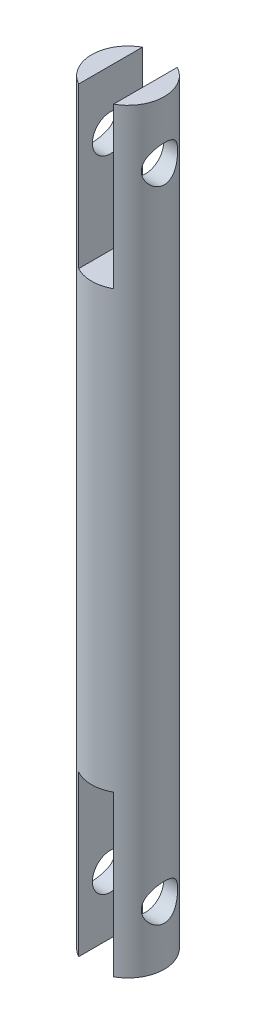
ISO-10303-21;
HEADER;
FILE_DESCRIPTION(('STEP AP214'),'2;1');
FILE_NAME('part.step','',(''),(''),'','','');
FILE_SCHEMA(('AUTOMOTIVE_DESIGN { 1 0 10303 214 1 1 1 1 }'));
ENDSEC;
DATA;
#1=APPLICATION_CONTEXT('core data for automotive mechanical design processes');
#2=APPLICATION_PROTOCOL_DEFINITION('international standard','automotive_design',2000,#1);
#3=PRODUCT_CONTEXT('',#1,'mechanical');
#4=PRODUCT('Part','Part','',(#3));
#5=PRODUCT_RELATED_PRODUCT_CATEGORY('part','',(#4));
#6=PRODUCT_DEFINITION_FORMATION('','',#4);
#7=PRODUCT_DEFINITION_CONTEXT('part definition',#1,'design');
#8=PRODUCT_DEFINITION('design','',#6,#7);
#9=PRODUCT_DEFINITION_SHAPE('','',#8);
#10=(LENGTH_UNIT() NAMED_UNIT(*) SI_UNIT(.MILLI.,.METRE.));
#11=(NAMED_UNIT(*) PLANE_ANGLE_UNIT() SI_UNIT($,.RADIAN.));
#12=(NAMED_UNIT(*) SI_UNIT($,.STERADIAN.) SOLID_ANGLE_UNIT());
#13=UNCERTAINTY_MEASURE_WITH_UNIT(LENGTH_MEASURE(1.E-05),#10,'distance_accuracy_value','');
#14=(GEOMETRIC_REPRESENTATION_CONTEXT(3) GLOBAL_UNCERTAINTY_ASSIGNED_CONTEXT((#13)) GLOBAL_UNIT_ASSIGNED_CONTEXT((#10,
#11,#12)) REPRESENTATION_CONTEXT('',''));
#15=CARTESIAN_POINT('',(0.,0.,0.));
#16=DIRECTION('',(0.,0.,1.));
#17=DIRECTION('',(1.,0.,0.));
#18=AXIS2_PLACEMENT_3D('',#15,#16,#17);
#19=CARTESIAN_POINT('',(0.,52.,0.));
#20=DIRECTION('',(0.,1.,0.));
#21=DIRECTION('',(0.,0.,-1.));
#22=AXIS2_PLACEMENT_3D('',#19,#20,#21);
#23=PLANE('',#22);
#24=DIRECTION('',(0.,0.,-1.));
#25=VECTOR('',#24,1.);
#26=CARTESIAN_POINT('',(-1.2,52.,2.5));
#27=LINE('',#26,#25);
#28=CARTESIAN_POINT('',(-1.2,52.,2.19317121994613));
#29=VERTEX_POINT('',#28);
#30=CARTESIAN_POINT('',(-1.2,52.,-2.19317121994613));
#31=VERTEX_POINT('',#30);
#32=EDGE_CURVE('E114',#29,#31,#27,.T.);
#33=ORIENTED_EDGE('',*,*,#32,.T.);
#34=CARTESIAN_POINT('',(0.,52.,0.));
#35=DIRECTION('',(0.,-1.,0.));
#36=DIRECTION('',(0.,0.,-1.));
#37=AXIS2_PLACEMENT_3D('',#34,#35,#36);
#38=CIRCLE('',#37,2.5);
#39=EDGE_CURVE('E128',#29,#31,#38,.T.);
#40=ORIENTED_EDGE('',*,*,#39,.F.);
#41=EDGE_LOOP('',(#33,#40));
#42=FACE_BOUND('',#41,.T.);
#43=ADVANCED_FACE('F43',(#42),#23,.T.);
#44=CARTESIAN_POINT('',(-2.5,48.,0.));
#45=DIRECTION('',(1.,0.,0.));
#46=DIRECTION('',(0.,0.,1.));
#47=AXIS2_PLACEMENT_3D('',#44,#45,#46);
#48=CYLINDRICAL_SURFACE('',#47,1.25);
#49=CARTESIAN_POINT('',(-1.2,48.,0.));
#50=DIRECTION('',(1.,0.,0.));
#51=DIRECTION('',(0.,0.,-1.));
#52=AXIS2_PLACEMENT_3D('',#49,#50,#51);
#53=CIRCLE('',#52,1.25);
#54=CARTESIAN_POINT('',(-1.2,48.,-1.25));
#55=VERTEX_POINT('',#54);
#56=EDGE_CURVE('E213',#55,#55,#53,.F.);
#57=ORIENTED_EDGE('',*,*,#56,.F.);
#58=EDGE_LOOP('',(#57));
#59=FACE_BOUND('',#58,.T.);
#60=CARTESIAN_POINT('',(-2.5,46.75,0.));
#61=CARTESIAN_POINT('',(-2.49999641755189,46.7500041278994,0.0657149536912329));
#62=CARTESIAN_POINT('',(-2.49738113774397,46.7552125914021,0.131508249622541));
#63=CARTESIAN_POINT('',(-2.48717695046745,46.7758161004261,0.261150294085531));
#64=CARTESIAN_POINT('',(-2.47957859786229,46.7912304912471,0.324995108391879));
#65=CARTESIAN_POINT('',(-2.46020349254139,46.831492260771,0.448666931100718));
#66=CARTESIAN_POINT('',(-2.448442989719,46.85630298031,0.508508503673975));
#67=CARTESIAN_POINT('',(-2.42182220644723,46.9144632767062,0.623090771008206));
#68=CARTESIAN_POINT('',(-2.40696217041913,46.9478121803111,0.677831867487562));
#69=CARTESIAN_POINT('',(-2.37445322822571,47.0243965618566,0.784384772202396));
#70=CARTESIAN_POINT('',(-2.3566899890942,47.0681080990496,0.835819013902634));
#71=CARTESIAN_POINT('',(-2.32074962808431,47.1631518490588,0.930974306083716));
#72=CARTESIAN_POINT('',(-2.30257220261294,47.2144898147155,0.974689478883455));
#73=CARTESIAN_POINT('',(-2.26623688996684,47.3281041869042,1.05656500056285));
#74=CARTESIAN_POINT('',(-2.24818983712665,47.3909201229324,1.09403166943955));
#75=CARTESIAN_POINT('',(-2.21607473465401,47.5229591699828,1.15771028361337));
#76=CARTESIAN_POINT('',(-2.20200384508737,47.5921776609034,1.18393026870792));
#77=CARTESIAN_POINT('',(-2.18072333797261,47.7308313817774,1.22266555273573));
#78=CARTESIAN_POINT('',(-2.17315339479642,47.8000055650842,1.23590732135055));
#79=CARTESIAN_POINT('',(-2.1647736243566,47.9399735472244,1.25053374163606));
#80=CARTESIAN_POINT('',(-2.1639571167911,48.0107656760889,1.25193011046634));
#81=CARTESIAN_POINT('',(-2.16888662821561,48.1428575303942,1.24335910896537));
#82=CARTESIAN_POINT('',(-2.17385954577517,48.2042800390288,1.23473069942102));
#83=CARTESIAN_POINT('',(-2.18845285917313,48.3246523867163,1.20867481132116));
#84=CARTESIAN_POINT('',(-2.1980747353972,48.3836014316316,1.19124452987206));
#85=CARTESIAN_POINT('',(-2.22109345515926,48.4990364157071,1.1477622254825));
#86=CARTESIAN_POINT('',(-2.23457300829998,48.5554329984822,1.12151883389499));
#87=CARTESIAN_POINT('',(-2.26379255351755,48.6632928657375,1.061302109585));
#88=CARTESIAN_POINT('',(-2.27953355975238,48.7147539195001,1.02732530476558));
#89=CARTESIAN_POINT('',(-2.31391447379107,48.818151565929,0.947582568640984));
#90=CARTESIAN_POINT('',(-2.33266887795933,48.8693210919702,0.9008680729616));
#91=CARTESIAN_POINT('',(-2.36934529125509,48.9634192732386,0.799444473426714));
#92=CARTESIAN_POINT('',(-2.38726689948501,49.0063439900424,0.744731570717854));
#93=CARTESIAN_POINT('',(-2.42127484103705,49.0846070762872,0.625645632289809));
#94=CARTESIAN_POINT('',(-2.43723730202509,49.1195005905572,0.56094198949926));
#95=CARTESIAN_POINT('',(-2.46447351401553,49.1776212863038,0.425582769360996));
#96=CARTESIAN_POINT('',(-2.47575098679441,49.200857731269,0.354931970331595));
#97=CARTESIAN_POINT('',(-2.49155417176795,49.2330942546458,0.215958114575876));
#98=CARTESIAN_POINT('',(-2.4965617287664,49.2431140446835,0.147926913185405));
#99=CARTESIAN_POINT('',(-2.50091266823877,49.2518309139181,0.0109744999366913));
#100=CARTESIAN_POINT('',(-2.5002587340164,49.2505333570493,-0.0579462748373776));
#101=CARTESIAN_POINT('',(-2.49363990316801,49.2372416394766,-0.189041214982493));
#102=CARTESIAN_POINT('',(-2.48809057110237,49.2260843340875,-0.251324260062444));
#103=CARTESIAN_POINT('',(-2.47277714143524,49.1947024101311,-0.373008615377397));
#104=CARTESIAN_POINT('',(-2.46301257917916,49.1744767919333,-0.432409607113746));
#105=CARTESIAN_POINT('',(-2.43980314267087,49.1250019169585,-0.548610760562083));
#106=CARTESIAN_POINT('',(-2.42626102212424,49.095511187354,-0.605287996257694));
#107=CARTESIAN_POINT('',(-2.39679967896386,49.0286155804424,-0.713076702123653));
#108=CARTESIAN_POINT('',(-2.38087944457231,48.9912073317582,-0.764185787219102));
#109=CARTESIAN_POINT('',(-2.34635276671831,48.9052994683339,-0.864709611613315));
#110=CARTESIAN_POINT('',(-2.32763606060552,48.856071414433,-0.913465097280797));
#111=CARTESIAN_POINT('',(-2.29077989504843,48.7500935609134,-1.00232040139155));
#112=CARTESIAN_POINT('',(-2.27264084226908,48.6933386014795,-1.04241423211355));
#113=CARTESIAN_POINT('',(-2.23813990282585,48.5704454322496,-1.11463489312212));
#114=CARTESIAN_POINT('',(-2.2219066207934,48.5039859172393,-1.14628186984829));
#115=CARTESIAN_POINT('',(-2.19467590460158,48.3656124153843,-1.19760353251725));
#116=CARTESIAN_POINT('',(-2.18367172800773,48.2937055918735,-1.21729364485946));
#117=CARTESIAN_POINT('',(-2.16951876260834,48.1538622214232,-1.2423271093121));
#118=CARTESIAN_POINT('',(-2.16571729325614,48.0862071832137,-1.24886624550108));
#119=CARTESIAN_POINT('',(-2.16456693307719,47.9506911660366,-1.25086144297598));
#120=CARTESIAN_POINT('',(-2.16721524534441,47.8828302890757,-1.2463223082805));
#121=CARTESIAN_POINT('',(-2.17797327562531,47.755645623085,-1.22740765699033));
#122=CARTESIAN_POINT('',(-2.18553868102992,47.6961244123195,-1.2140103929285));
#123=CARTESIAN_POINT('',(-2.20463770234897,47.5802398507191,-1.1789691977808));
#124=CARTESIAN_POINT('',(-2.21617259462095,47.523877522385,-1.15732261394976));
#125=CARTESIAN_POINT('',(-2.2428566295566,47.4117189362667,-1.10476968162585));
#126=CARTESIAN_POINT('',(-2.25819652995238,47.3562151227129,-1.07333892227057));
#127=CARTESIAN_POINT('',(-2.29044164543238,47.2509068297743,-1.00268871454579));
#128=CARTESIAN_POINT('',(-2.30734767243153,47.2011053368519,-0.963465214048306));
#129=CARTESIAN_POINT('',(-2.34327903949141,47.102322522053,-0.872754158330797));
#130=CARTESIAN_POINT('',(-2.36231229139336,47.0541761220476,-0.820355528762708));
#131=CARTESIAN_POINT('',(-2.3984719031886,46.9671712707205,-0.707693507775343));
#132=CARTESIAN_POINT('',(-2.4155972326005,46.9283178257171,-0.647425904070976));
#133=CARTESIAN_POINT('',(-2.44622511981379,46.8609545465472,-0.519914496024928));
#134=CARTESIAN_POINT('',(-2.45970120703636,46.8325197882357,-0.452624379918262));
#135=CARTESIAN_POINT('',(-2.48126676704332,46.7877397901013,-0.313427626617734));
#136=CARTESIAN_POINT('',(-2.48937154216165,46.771360191463,-0.241534749528954));
#137=CARTESIAN_POINT('',(-2.49619327387079,46.7576282361552,-0.140752433104227));
#138=CARTESIAN_POINT('',(-2.49761706674002,46.7547716989205,-0.112702349299371));
#139=CARTESIAN_POINT('',(-2.49952121222331,46.750956668104,-0.0564396647589457));
#140=CARTESIAN_POINT('',(-2.50000153879704,46.749998226911,-0.0282270595592261));
#141=CARTESIAN_POINT('',(-2.5,46.75,0.));
#142=B_SPLINE_CURVE_WITH_KNOTS('',3,(#60,#61,#62,#63,#64,#65,#66,#67,#68,#69,#70,#71,#72,#73,
#74,#75,#76,#77,#78,#79,#80,#81,#82,#83,#84,#85,#86,#87,#88,#89,#90,#91,#92,#93,#94,#95,#96,#97,
#98,#99,#100,#101,#102,#103,#104,#105,#106,#107,#108,#109,#110,#111,#112,#113,#114,#115,#116,
#117,#118,#119,#120,#121,#122,#123,#124,#125,#126,#127,#128,#129,#130,#131,#132,#133,#134,#135,
#136,#137,#138,#139,#140,#141),.UNSPECIFIED.,.T.,.F.,(4,2,2,2,2,2,2,2,2,2,2,2,2,2,2,2,2,2,2,2,2,
2,2,2,2,2,2,2,2,2,2,2,2,2,2,2,2,2,2,2,4),(0.,0.197030321775365,0.394435187136497,
0.591077694365375,0.787704700726956,0.9962271983976,1.20490779706754,1.42977158038441,
1.65447434872851,1.86572515175287,2.07676696661275,2.2625714051165,2.44843504907097,
2.63862800210609,2.82890651575277,3.04331176667347,3.25781918248357,3.4822877776805,
3.70657771140349,3.91229113089181,4.11790705639344,4.30758633132651,4.49728652038664,
4.69241070034873,4.88761813435423,5.10199513305522,5.31651985769288,5.54143352699591,
5.76605639925971,5.96911634372966,6.17208824825005,6.35572412805227,6.53941910979597,
6.73545570969517,6.93159451423696,7.15156553440622,7.37165479220715,7.59330017078655,
7.81431135781161,7.8989410017212,7.98357298143557),.UNSPECIFIED.);
#143=CARTESIAN_POINT('',(-2.5,46.75,0.));
#144=VERTEX_POINT('',#143);
#145=EDGE_CURVE('E158',#144,#144,#142,.T.);
#146=ORIENTED_EDGE('',*,*,#145,.T.);
#147=EDGE_LOOP('',(#146));
#148=FACE_BOUND('',#147,.T.);
#149=ADVANCED_FACE('F171',(#59,#148),#48,.F.);
#150=CARTESIAN_POINT('',(0.,52.,0.));
#151=DIRECTION('',(0.,-1.,0.));
#152=DIRECTION('',(0.,0.,1.));
#153=AXIS2_PLACEMENT_3D('',#150,#151,#152);
#154=CYLINDRICAL_SURFACE('',#153,2.5);
#155=CARTESIAN_POINT('',(0.,41.,0.));
#156=DIRECTION('',(0.,1.,0.));
#157=DIRECTION('',(0.,0.,1.));
#158=AXIS2_PLACEMENT_3D('',#155,#156,#157);
#159=CIRCLE('',#158,2.5);
#160=CARTESIAN_POINT('',(1.2,41.,-2.19317121994613));
#161=VERTEX_POINT('',#160);
#162=CARTESIAN_POINT('',(-1.2,41.,-2.19317121994613));
#163=VERTEX_POINT('',#162);
#164=EDGE_CURVE('E11',#161,#163,#159,.T.);
#165=ORIENTED_EDGE('',*,*,#164,.F.);
#166=DIRECTION('',(0.,-1.,0.));
#167=VECTOR('',#166,1.);
#168=CARTESIAN_POINT('',(1.2,52.,-2.19317121994613));
#169=LINE('',#168,#167);
#170=CARTESIAN_POINT('',(1.2,52.,-2.19317121994613));
#171=VERTEX_POINT('',#170);
#172=EDGE_CURVE('E123',#171,#161,#169,.T.);
#173=ORIENTED_EDGE('',*,*,#172,.F.);
#174=CARTESIAN_POINT('',(1.2,52.,2.19317121994613));
#175=VERTEX_POINT('',#174);
#176=EDGE_CURVE('E111',#171,#175,#38,.T.);
#177=ORIENTED_EDGE('',*,*,#176,.T.);
#178=DIRECTION('',(0.,-1.,0.));
#179=VECTOR('',#178,1.);
#180=CARTESIAN_POINT('',(1.2,52.,2.19317121994613));
#181=LINE('',#180,#179);
#182=CARTESIAN_POINT('',(1.2,41.,2.19317121994613));
#183=VERTEX_POINT('',#182);
#184=EDGE_CURVE('E117',#183,#175,#181,.F.);
#185=ORIENTED_EDGE('',*,*,#184,.F.);
#186=CARTESIAN_POINT('',(-1.2,41.,2.19317121994613));
#187=VERTEX_POINT('',#186);
#188=EDGE_CURVE('E48',#187,#183,#159,.T.);
#189=ORIENTED_EDGE('',*,*,#188,.F.);
#190=DIRECTION('',(0.,-1.,0.));
#191=VECTOR('',#190,1.);
#192=CARTESIAN_POINT('',(-1.2,52.,2.19317121994613));
#193=LINE('',#192,#191);
#194=EDGE_CURVE('E150',#29,#187,#193,.T.);
#195=ORIENTED_EDGE('',*,*,#194,.F.);
#196=ORIENTED_EDGE('',*,*,#39,.T.);
#197=DIRECTION('',(0.,-1.,0.));
#198=VECTOR('',#197,1.);
#199=CARTESIAN_POINT('',(-1.2,52.,-2.19317121994613));
#200=LINE('',#199,#198);
#201=EDGE_CURVE('E214',#163,#31,#200,.F.);
#202=ORIENTED_EDGE('',*,*,#201,.F.);
#203=EDGE_LOOP('',(#165,#173,#177,#185,#189,#195,#196,#202));
#204=FACE_BOUND('',#203,.T.);
#205=CARTESIAN_POINT('',(-2.5,2.75,0.));
#206=CARTESIAN_POINT('',(-2.49999641755189,2.75000412789938,0.0657149536912331));
#207=CARTESIAN_POINT('',(-2.49738113774397,2.75521259140209,0.131508249622541));
#208=CARTESIAN_POINT('',(-2.48717695046745,2.77581610042615,0.261150294085532));
#209=CARTESIAN_POINT('',(-2.47957859786229,2.79123049124706,0.32499510839188));
#210=CARTESIAN_POINT('',(-2.46020349254139,2.83149226077099,0.448666931100718));
#211=CARTESIAN_POINT('',(-2.448442989719,2.85630298031002,0.508508503673975));
#212=CARTESIAN_POINT('',(-2.42182220644723,2.91446327670618,0.623090771008207));
#213=CARTESIAN_POINT('',(-2.40696217041912,2.94781218031107,0.677831867487563));
#214=CARTESIAN_POINT('',(-2.37445322822571,3.02439656185662,0.784384772202399));
#215=CARTESIAN_POINT('',(-2.3566899890942,3.06810809904955,0.835819013902641));
#216=CARTESIAN_POINT('',(-2.3207496280843,3.16315184905879,0.930974306083722));
#217=CARTESIAN_POINT('',(-2.30257220261294,3.21448981471555,0.974689478883458));
#218=CARTESIAN_POINT('',(-2.26623688996684,3.32810418690423,1.05656500056285));
#219=CARTESIAN_POINT('',(-2.24818983712665,3.39092012293239,1.09403166943955));
#220=CARTESIAN_POINT('',(-2.21607473465401,3.52295916998277,1.15771028361337));
#221=CARTESIAN_POINT('',(-2.20200384508737,3.59217766090344,1.18393026870792));
#222=CARTESIAN_POINT('',(-2.18072333797261,3.7308313817774,1.22266555273573));
#223=CARTESIAN_POINT('',(-2.17315339479642,3.80000556508424,1.23590732135055));
#224=CARTESIAN_POINT('',(-2.1647736243566,3.93997354722434,1.25053374163606));
#225=CARTESIAN_POINT('',(-2.1639571167911,4.01076567608894,1.25193011046634));
#226=CARTESIAN_POINT('',(-2.16888662821561,4.14285753039421,1.24335910896537));
#227=CARTESIAN_POINT('',(-2.17385954577517,4.20428003902881,1.23473069942103));
#228=CARTESIAN_POINT('',(-2.18845285917313,4.3246523867163,1.20867481132117));
#229=CARTESIAN_POINT('',(-2.1980747353972,4.38360143163164,1.19124452987206));
#230=CARTESIAN_POINT('',(-2.22109345515926,4.49903641570707,1.1477622254825));
#231=CARTESIAN_POINT('',(-2.23457300829998,4.55543299848223,1.12151883389499));
#232=CARTESIAN_POINT('',(-2.26379255351755,4.66329286573751,1.061302109585));
#233=CARTESIAN_POINT('',(-2.27953355975238,4.71475391950011,1.02732530476558));
#234=CARTESIAN_POINT('',(-2.31391447379107,4.81815156592903,0.947582568640986));
#235=CARTESIAN_POINT('',(-2.33266887795933,4.8693210919702,0.900868072961602));
#236=CARTESIAN_POINT('',(-2.36934529125509,4.96341927323863,0.799444473426716));
#237=CARTESIAN_POINT('',(-2.38726689948501,5.00634399004235,0.744731570717856));
#238=CARTESIAN_POINT('',(-2.42127484103705,5.08460707628716,0.625645632289809));
#239=CARTESIAN_POINT('',(-2.43723730202509,5.11950059055718,0.56094198949926));
#240=CARTESIAN_POINT('',(-2.46447351401553,5.17762128630376,0.425582769360995));
#241=CARTESIAN_POINT('',(-2.47575098679441,5.20085773126896,0.354931970331594));
#242=CARTESIAN_POINT('',(-2.49155417176795,5.23309425464584,0.215958114575876));
#243=CARTESIAN_POINT('',(-2.4965617287664,5.24311404468347,0.147926913185404));
#244=CARTESIAN_POINT('',(-2.50091266823877,5.25183091391811,0.0109744999366911));
#245=CARTESIAN_POINT('',(-2.5002587340164,5.25053335704935,-0.0579462748373775));
#246=CARTESIAN_POINT('',(-2.49363990316801,5.23724163947656,-0.189041214982492));
#247=CARTESIAN_POINT('',(-2.48809057110237,5.22608433408746,-0.251324260062443));
#248=CARTESIAN_POINT('',(-2.47277714143524,5.19470241013114,-0.373008615377396));
#249=CARTESIAN_POINT('',(-2.46301257917916,5.1744767919333,-0.432409607113746));
#250=CARTESIAN_POINT('',(-2.43980314267087,5.12500191695853,-0.548610760562081));
#251=CARTESIAN_POINT('',(-2.42626102212424,5.09551118735398,-0.605287996257691));
#252=CARTESIAN_POINT('',(-2.39679967896386,5.02861558044245,-0.71307670212365));
#253=CARTESIAN_POINT('',(-2.38087944457231,4.99120733175821,-0.764185787219102));
#254=CARTESIAN_POINT('',(-2.34635276671831,4.90529946833391,-0.864709611613316));
#255=CARTESIAN_POINT('',(-2.32763606060552,4.85607141443304,-0.913465097280798));
#256=CARTESIAN_POINT('',(-2.29077989504843,4.75009356091337,-1.00232040139155));
#257=CARTESIAN_POINT('',(-2.27264084226908,4.69333860147953,-1.04241423211355));
#258=CARTESIAN_POINT('',(-2.23813990282585,4.57044543224961,-1.11463489312212));
#259=CARTESIAN_POINT('',(-2.2219066207934,4.50398591723926,-1.1462818698483));
#260=CARTESIAN_POINT('',(-2.19467590460158,4.36561241538435,-1.19760353251725));
#261=CARTESIAN_POINT('',(-2.18367172800773,4.29370559187352,-1.21729364485946));
#262=CARTESIAN_POINT('',(-2.16951876260833,4.15386222142319,-1.2423271093121));
#263=CARTESIAN_POINT('',(-2.16571729325614,4.0862071832137,-1.24886624550108));
#264=CARTESIAN_POINT('',(-2.16456693307719,3.95069116603659,-1.25086144297598));
#265=CARTESIAN_POINT('',(-2.16721524534441,3.88283028907571,-1.2463223082805));
#266=CARTESIAN_POINT('',(-2.17797327562531,3.75564562308498,-1.22740765699033));
#267=CARTESIAN_POINT('',(-2.18553868102992,3.6961244123195,-1.2140103929285));
#268=CARTESIAN_POINT('',(-2.20463770234897,3.58023985071912,-1.17896919778081));
#269=CARTESIAN_POINT('',(-2.21617259462095,3.52387752238504,-1.15732261394976));
#270=CARTESIAN_POINT('',(-2.2428566295566,3.41171893626674,-1.10476968162585));
#271=CARTESIAN_POINT('',(-2.25819652995238,3.35621512271287,-1.07333892227057));
#272=CARTESIAN_POINT('',(-2.29044164543238,3.25090682977427,-1.00268871454579));
#273=CARTESIAN_POINT('',(-2.30734767243153,3.20110533685189,-0.963465214048309));
#274=CARTESIAN_POINT('',(-2.34327903949141,3.10232252205298,-0.8727541583308));
#275=CARTESIAN_POINT('',(-2.36231229139336,3.0541761220476,-0.820355528762712));
#276=CARTESIAN_POINT('',(-2.3984719031886,2.96717127072046,-0.707693507775348));
#277=CARTESIAN_POINT('',(-2.4155972326005,2.92831782571714,-0.64742590407098));
#278=CARTESIAN_POINT('',(-2.44622511981379,2.86095454654725,-0.519914496024933));
#279=CARTESIAN_POINT('',(-2.45970120703636,2.83251978823571,-0.452624379918268));
#280=CARTESIAN_POINT('',(-2.48126676704332,2.78773979010131,-0.313427626617739));
#281=CARTESIAN_POINT('',(-2.48937154216165,2.77136019146303,-0.241534749528957));
#282=CARTESIAN_POINT('',(-2.49619327387079,2.75762823615519,-0.140752433104229));
#283=CARTESIAN_POINT('',(-2.49761706674002,2.75477169892048,-0.112702349299373));
#284=CARTESIAN_POINT('',(-2.49952121222331,2.75095666810399,-0.0564396647589469));
#285=CARTESIAN_POINT('',(-2.50000153879704,2.749998226911,-0.0282270595592267));
#286=CARTESIAN_POINT('',(-2.5,2.75,0.));
#287=B_SPLINE_CURVE_WITH_KNOTS('',3,(#205,#206,#207,#208,#209,#210,#211,#212,#213,#214,#215,
#216,#217,#218,#219,#220,#221,#222,#223,#224,#225,#226,#227,#228,#229,#230,#231,#232,#233,#234,
#235,#236,#237,#238,#239,#240,#241,#242,#243,#244,#245,#246,#247,#248,#249,#250,#251,#252,#253,
#254,#255,#256,#257,#258,#259,#260,#261,#262,#263,#264,#265,#266,#267,#268,#269,#270,#271,#272,
#273,#274,#275,#276,#277,#278,#279,#280,#281,#282,#283,#284,#285,#286),.UNSPECIFIED.,.T.,.F.,(4,
2,2,2,2,2,2,2,2,2,2,2,2,2,2,2,2,2,2,2,2,2,2,2,2,2,2,2,2,2,2,2,2,2,2,2,2,2,2,2,4),(0.,
0.197030321775366,0.394435187136497,0.591077694365373,0.78770470072696,0.996227198397612,
1.20490779706755,1.42977158038441,1.65447434872851,1.86572515175287,2.07676696661275,
2.2625714051165,2.44843504907098,2.63862800210609,2.82890651575277,3.04331176667348,
3.25781918248358,3.48228777768051,3.70657771140349,3.91229113089182,4.11790705639345,
4.30758633132652,4.49728652038664,4.69241070034873,4.88761813435424,5.10199513305523,
5.31651985769289,5.54143352699592,5.76605639925972,5.96911634372967,6.17208824825007,
6.35572412805228,6.53941910979597,6.73545570969517,6.93159451423697,7.15156553440623,
7.37165479220716,7.59330017078656,7.81431135781162,7.89894100172122,7.98357298143558),.UNSPECIFIED.);
#288=CARTESIAN_POINT('',(-2.5,2.75,0.));
#289=VERTEX_POINT('',#288);
#290=EDGE_CURVE('E225',#289,#289,#287,.T.);
#291=ORIENTED_EDGE('',*,*,#290,.F.);
#292=EDGE_LOOP('',(#291));
#293=FACE_BOUND('',#292,.T.);
#294=CARTESIAN_POINT('',(2.1650635094611,4.,1.25));
#295=CARTESIAN_POINT('',(2.16506918410574,3.93486523975594,1.24999545384316));
#296=CARTESIAN_POINT('',(2.16804751484696,3.86964823559369,1.24487496341652));
#297=CARTESIAN_POINT('',(2.17952958065066,3.74121591915356,1.22465401237257));
#298=CARTESIAN_POINT('',(2.18804492569449,3.67800510619574,1.20953258069272));
#299=CARTESIAN_POINT('',(2.20936683256748,3.55568541957007,1.17012493587476));
#300=CARTESIAN_POINT('',(2.22215054341565,3.49655668440802,1.14588744061716));
#301=CARTESIAN_POINT('',(2.25053331021072,3.3832197475041,1.08908440672047));
#302=CARTESIAN_POINT('',(2.26613251845081,3.32901181217193,1.05651841754472));
#303=CARTESIAN_POINT('',(2.29996086321802,3.22211783930312,0.980833175663599));
#304=CARTESIAN_POINT('',(2.31830079547442,3.16992608040807,0.937065045179714));
#305=CARTESIAN_POINT('',(2.35464978482132,3.07323951449162,0.841567259518087));
#306=CARTESIAN_POINT('',(2.37265867289062,3.0287485467706,0.789833657227868));
#307=CARTESIAN_POINT('',(2.40776846191186,2.94579106106542,0.675611954268185));
#308=CARTESIAN_POINT('',(2.42472633022716,2.90793279017559,0.612633986265721));
#309=CARTESIAN_POINT('',(2.45438445124411,2.8435739334428,0.480196283249383));
#310=CARTESIAN_POINT('',(2.46708738979677,2.81706617982854,0.410740672672698));
#311=CARTESIAN_POINT('',(2.48600576555297,2.77811917337363,0.272556179907475));
#312=CARTESIAN_POINT('',(2.49261850276115,2.76481309205559,0.204127238111026));
#313=CARTESIAN_POINT('',(2.50009479807584,2.7497923516562,0.0657132858723139));
#314=CARTESIAN_POINT('',(2.50096183480737,2.74807067900536,-0.00427075730466945));
#315=CARTESIAN_POINT('',(2.49703727395563,2.75593334246294,-0.137290655529684));
#316=CARTESIAN_POINT('',(2.49273119865201,2.76454751940153,-0.200401498970986));
#317=CARTESIAN_POINT('',(2.47967806574684,2.79110105488082,-0.3241422148979));
#318=CARTESIAN_POINT('',(2.47093067582992,2.80904111122028,-0.384771901367404));
#319=CARTESIAN_POINT('',(2.44964479109568,2.85385320761227,-0.50288673946194));
#320=CARTESIAN_POINT('',(2.43705551911499,2.88084539146508,-0.560316779393971));
#321=CARTESIAN_POINT('',(2.40922057483359,2.94282927025187,-0.669971001891658));
#322=CARTESIAN_POINT('',(2.39397395196855,2.97782382912794,-0.722193311048305));
#323=CARTESIAN_POINT('',(2.36055492999037,3.05861918941627,-0.825217076122742));
#324=CARTESIAN_POINT('',(2.34224219997719,3.10512878540751,-0.875417593786699));
#325=CARTESIAN_POINT('',(2.30567925733515,3.20573715616272,-0.967630462872223));
#326=CARTESIAN_POINT('',(2.28742910332036,3.25984171534258,-1.00963651446779));
#327=CARTESIAN_POINT('',(2.25180195115606,3.37831024053011,-1.08688166830276));
#328=CARTESIAN_POINT('',(2.23455399988385,3.44310752881776,-1.12152164372256));
#329=CARTESIAN_POINT('',(2.2046931284822,3.57867208919875,-1.17914889125154));
#330=CARTESIAN_POINT('',(2.19207537557584,3.64943304127195,-1.20214832276361));
#331=CARTESIAN_POINT('',(2.17430794771293,3.78901813910349,-1.2339752637813));
#332=CARTESIAN_POINT('',(2.16864569810621,3.85755139880444,-1.24378140264997));
#333=CARTESIAN_POINT('',(2.16397399202012,3.99550167689567,-1.25189618326428));
#334=CARTESIAN_POINT('',(2.1649598361164,4.06491803639973,-1.25021294664378));
#335=CARTESIAN_POINT('',(2.17292920675731,4.19456739822341,-1.23629505417996));
#336=CARTESIAN_POINT('',(2.17924484383318,4.2549743138849,-1.22523477089058));
#337=CARTESIAN_POINT('',(2.19617526939176,4.37295973283869,-1.19462035579055));
#338=CARTESIAN_POINT('',(2.20679145006292,4.43053731343326,-1.17506347327952));
#339=CARTESIAN_POINT('',(2.23170277599571,4.54426416362837,-1.12705948575611));
#340=CARTESIAN_POINT('',(2.24614554053829,4.60022377106694,-1.09824257961591));
#341=CARTESIAN_POINT('',(2.27695149371562,4.70683658942374,-1.03285883001976));
#342=CARTESIAN_POINT('',(2.29331566693934,4.7574870543916,-0.996288005415272));
#343=CARTESIAN_POINT('',(2.3285999807042,4.85872345940443,-0.911046458998569));
#344=CARTESIAN_POINT('',(2.34758228942861,4.90849643839707,-0.86143159039371));
#345=CARTESIAN_POINT('',(2.38417793722366,4.99926529749199,-0.754255619247862));
#346=CARTESIAN_POINT('',(2.40179081259637,5.04025821278817,-0.696691843319186));
#347=CARTESIAN_POINT('',(2.43426702113696,5.11321715743763,-0.573169203198449));
#348=CARTESIAN_POINT('',(2.44904552090036,5.14491639776364,-0.507028871967643));
#349=CARTESIAN_POINT('',(2.47354193699126,5.19642237982174,-0.369402955801354));
#350=CARTESIAN_POINT('',(2.48326429595466,5.21623956420788,-0.297922126740222));
#351=CARTESIAN_POINT('',(2.49584385227353,5.24171070521833,-0.158724602913023));
#352=CARTESIAN_POINT('',(2.49924909885239,5.24849734484514,-0.0912643048130729));
#353=CARTESIAN_POINT('',(2.50052662968914,5.251054081818,0.0439074824390028));
#354=CARTESIAN_POINT('',(2.49840085083612,5.24682803565445,0.111618875368857));
#355=CARTESIAN_POINT('',(2.48917461047403,5.22822949150547,0.240672490396432));
#356=CARTESIAN_POINT('',(2.48241118334987,5.21454393842791,0.302140397264078));
#357=CARTESIAN_POINT('',(2.46490117079279,5.17834125087129,0.42180744022952));
#358=CARTESIAN_POINT('',(2.45415401415995,5.15582284988318,0.480006106194384));
#359=CARTESIAN_POINT('',(2.4290741343515,5.10159118479253,0.594279257806103));
#360=CARTESIAN_POINT('',(2.41460771498499,5.0695258459902,0.650156428375055));
#361=CARTESIAN_POINT('',(2.38360166427283,4.99755258642619,0.755968302267528));
#362=CARTESIAN_POINT('',(2.36706108197951,4.95764106360541,0.805900259268631));
#363=CARTESIAN_POINT('',(2.33160762783285,4.86650357622162,0.903642505196111));
#364=CARTESIAN_POINT('',(2.31262248764623,4.81454689065351,0.950747105674087));
#365=CARTESIAN_POINT('',(2.27578845203566,4.70318659858779,1.03582910924334));
#366=CARTESIAN_POINT('',(2.25794057202332,4.6437764739154,1.07379843751257));
#367=CARTESIAN_POINT('',(2.22499506631145,4.51670419177381,1.14053884973207));
#368=CARTESIAN_POINT('',(2.21000217820338,4.44884058608908,1.16898133245117));
#369=CARTESIAN_POINT('',(2.1858269541044,4.30833449457528,1.21359838688301));
#370=CARTESIAN_POINT('',(2.17662520184628,4.23570888885914,1.22981398896918));
#371=CARTESIAN_POINT('',(2.16911590752238,4.13524330543501,1.24295875983052));
#372=CARTESIAN_POINT('',(2.1676016125644,4.10829013200265,1.24559513120481));
#373=CARTESIAN_POINT('',(2.16557419859688,4.0542293991472,1.24911675636245));
#374=CARTESIAN_POINT('',(2.16506114656387,4.02712182951766,1.25000189299984));
#375=CARTESIAN_POINT('',(2.1650635094611,4.,1.25));
#376=B_SPLINE_CURVE_WITH_KNOTS('',3,(#294,#295,#296,#297,#298,#299,#300,#301,#302,#303,#304,
#305,#306,#307,#308,#309,#310,#311,#312,#313,#314,#315,#316,#317,#318,#319,#320,#321,#322,#323,
#324,#325,#326,#327,#328,#329,#330,#331,#332,#333,#334,#335,#336,#337,#338,#339,#340,#341,#342,
#343,#344,#345,#346,#347,#348,#349,#350,#351,#352,#353,#354,#355,#356,#357,#358,#359,#360,#361,
#362,#363,#364,#365,#366,#367,#368,#369,#370,#371,#372,#373,#374,#375),.UNSPECIFIED.,.T.,.F.,(4,
2,2,2,2,2,2,2,2,2,2,2,2,2,2,2,2,2,2,2,2,2,2,2,2,2,2,2,2,2,2,2,2,2,2,2,2,2,2,2,4),(0.,
0.195290153243394,0.390991116031005,0.585660744898606,0.780340906806435,0.991077890622789,
1.20191963855463,1.42697365298454,1.65188533704863,1.86079356209918,2.0695752960755,
2.26020121855672,2.45084140646818,2.64411918413933,2.83746624187839,3.04908989321113,
3.26087560307398,3.4861105216181,3.71110967764631,3.91827863567764,4.12530116485466,
4.30967729280031,4.49411315545078,4.68709120507609,4.88016857775058,5.09758429475766,
5.31507331222752,5.53830226766206,5.76133474760964,5.96390337986858,6.16640108492464,
6.35555531089365,6.54473666890015,6.74200938399339,6.93937287625898,7.15637802312583,
7.37357428556442,7.59763436298255,7.8209391625345,7.90225168981636,7.98356965618175),.UNSPECIFIED.);
#377=CARTESIAN_POINT('',(2.1650635094611,4.,1.25));
#378=VERTEX_POINT('',#377);
#379=EDGE_CURVE('E219',#378,#378,#376,.T.);
#380=ORIENTED_EDGE('',*,*,#379,.F.);
#381=EDGE_LOOP('',(#380));
#382=FACE_BOUND('',#381,.T.);
#383=ORIENTED_EDGE('',*,*,#145,.F.);
#384=EDGE_LOOP('',(#383));
#385=FACE_BOUND('',#384,.T.);
#386=CARTESIAN_POINT('',(2.1650635094611,48.,1.25));
#387=CARTESIAN_POINT('',(2.16506918410574,47.9348652397559,1.24999545384316));
#388=CARTESIAN_POINT('',(2.16804751484696,47.8696482355937,1.24487496341652));
#389=CARTESIAN_POINT('',(2.17952958065066,47.7412159191536,1.22465401237257));
#390=CARTESIAN_POINT('',(2.18804492569449,47.6780051061957,1.20953258069272));
#391=CARTESIAN_POINT('',(2.20936683256748,47.5556854195701,1.17012493587476));
#392=CARTESIAN_POINT('',(2.22215054341565,47.496556684408,1.14588744061716));
#393=CARTESIAN_POINT('',(2.25053331021072,47.3832197475041,1.08908440672046));
#394=CARTESIAN_POINT('',(2.26613251845081,47.3290118121719,1.05651841754471));
#395=CARTESIAN_POINT('',(2.29996086321802,47.2221178393031,0.980833175663595));
#396=CARTESIAN_POINT('',(2.31830079547442,47.1699260804081,0.93706504517971));
#397=CARTESIAN_POINT('',(2.35464978482132,47.0732395144916,0.841567259518083));
#398=CARTESIAN_POINT('',(2.37265867289062,47.0287485467706,0.789833657227865));
#399=CARTESIAN_POINT('',(2.40776846191186,46.9457910610654,0.675611954268183));
#400=CARTESIAN_POINT('',(2.42472633022716,46.9079327901756,0.61263398626572));
#401=CARTESIAN_POINT('',(2.45438445124411,46.8435739334428,0.480196283249383));
#402=CARTESIAN_POINT('',(2.46708738979677,46.8170661798285,0.410740672672697));
#403=CARTESIAN_POINT('',(2.48600576555297,46.7781191733736,0.272556179907475));
#404=CARTESIAN_POINT('',(2.49261850276115,46.7648130920556,0.204127238111025));
#405=CARTESIAN_POINT('',(2.50009479807584,46.7497923516562,0.0657132858723139));
#406=CARTESIAN_POINT('',(2.50096183480737,46.7480706790054,-0.00427075730466915));
#407=CARTESIAN_POINT('',(2.49703727395563,46.7559333424629,-0.137290655529684));
#408=CARTESIAN_POINT('',(2.49273119865201,46.7645475194015,-0.200401498970986));
#409=CARTESIAN_POINT('',(2.47967806574684,46.7911010548808,-0.3241422148979));
#410=CARTESIAN_POINT('',(2.47093067582992,46.8090411112203,-0.384771901367404));
#411=CARTESIAN_POINT('',(2.44964479109568,46.8538532076123,-0.502886739461939));
#412=CARTESIAN_POINT('',(2.43705551911499,46.8808453914651,-0.56031677939397));
#413=CARTESIAN_POINT('',(2.40922057483359,46.9428292702519,-0.669971001891658));
#414=CARTESIAN_POINT('',(2.39397395196855,46.9778238291279,-0.722193311048306));
#415=CARTESIAN_POINT('',(2.36055492999037,47.0586191894163,-0.825217076122743));
#416=CARTESIAN_POINT('',(2.34224219997719,47.1051287854075,-0.875417593786699));
#417=CARTESIAN_POINT('',(2.30567925733515,47.2057371561627,-0.967630462872223));
#418=CARTESIAN_POINT('',(2.28742910332036,47.2598417153426,-1.00963651446779));
#419=CARTESIAN_POINT('',(2.25180195115606,47.3783102405301,-1.08688166830276));
#420=CARTESIAN_POINT('',(2.23455399988384,47.4431075288178,-1.12152164372256));
#421=CARTESIAN_POINT('',(2.2046931284822,47.5786720891987,-1.17914889125154));
#422=CARTESIAN_POINT('',(2.19207537557584,47.649433041272,-1.20214832276361));
#423=CARTESIAN_POINT('',(2.17430794771293,47.7890181391035,-1.2339752637813));
#424=CARTESIAN_POINT('',(2.16864569810621,47.8575513988044,-1.24378140264997));
#425=CARTESIAN_POINT('',(2.16397399202012,47.9955016768957,-1.25189618326428));
#426=CARTESIAN_POINT('',(2.1649598361164,48.0649180363997,-1.25021294664378));
#427=CARTESIAN_POINT('',(2.17292920675731,48.1945673982234,-1.23629505417996));
#428=CARTESIAN_POINT('',(2.17924484383318,48.2549743138849,-1.22523477089058));
#429=CARTESIAN_POINT('',(2.19617526939176,48.3729597328387,-1.19462035579055));
#430=CARTESIAN_POINT('',(2.20679145006292,48.4305373134333,-1.17506347327952));
#431=CARTESIAN_POINT('',(2.23170277599571,48.5442641636284,-1.12705948575611));
#432=CARTESIAN_POINT('',(2.24614554053829,48.6002237710669,-1.0982425796159));
#433=CARTESIAN_POINT('',(2.27695149371562,48.7068365894237,-1.03285883001976));
#434=CARTESIAN_POINT('',(2.29331566693934,48.7574870543916,-0.996288005415271));
#435=CARTESIAN_POINT('',(2.3285999807042,48.8587234594044,-0.911046458998568));
#436=CARTESIAN_POINT('',(2.34758228942861,48.9084964383971,-0.86143159039371));
#437=CARTESIAN_POINT('',(2.38417793722365,48.999265297492,-0.754255619247864));
#438=CARTESIAN_POINT('',(2.40179081259636,49.0402582127882,-0.696691843319187));
#439=CARTESIAN_POINT('',(2.43426702113696,49.1132171574376,-0.57316920319845));
#440=CARTESIAN_POINT('',(2.44904552090036,49.1449163977636,-0.507028871967644));
#441=CARTESIAN_POINT('',(2.47354193699126,49.1964223798217,-0.369402955801354));
#442=CARTESIAN_POINT('',(2.48326429595466,49.2162395642079,-0.29792212674022));
#443=CARTESIAN_POINT('',(2.49584385227353,49.2417107052183,-0.158724602913021));
#444=CARTESIAN_POINT('',(2.49924909885239,49.2484973448451,-0.0912643048130715));
#445=CARTESIAN_POINT('',(2.50052662968914,49.251054081818,0.0439074824390033));
#446=CARTESIAN_POINT('',(2.49840085083612,49.2468280356545,0.111618875368857));
#447=CARTESIAN_POINT('',(2.48917461047403,49.2282294915055,0.240672490396431));
#448=CARTESIAN_POINT('',(2.48241118334987,49.2145439384279,0.302140397264077));
#449=CARTESIAN_POINT('',(2.46490117079279,49.1783412508713,0.421807440229519));
#450=CARTESIAN_POINT('',(2.45415401415995,49.1558228498832,0.480006106194384));
#451=CARTESIAN_POINT('',(2.4290741343515,49.1015911847925,0.594279257806104));
#452=CARTESIAN_POINT('',(2.41460771498499,49.0695258459902,0.650156428375056));
#453=CARTESIAN_POINT('',(2.38360166427283,48.9975525864262,0.75596830226753));
#454=CARTESIAN_POINT('',(2.36706108197951,48.9576410636054,0.805900259268633));
#455=CARTESIAN_POINT('',(2.33160762783285,48.8665035762216,0.903642505196114));
#456=CARTESIAN_POINT('',(2.31262248764622,48.8145468906535,0.95074710567409));
#457=CARTESIAN_POINT('',(2.27578845203565,48.7031865985878,1.03582910924334));
#458=CARTESIAN_POINT('',(2.25794057202332,48.6437764739154,1.07379843751257));
#459=CARTESIAN_POINT('',(2.22499506631145,48.5167041917738,1.14053884973207));
#460=CARTESIAN_POINT('',(2.21000217820338,48.4488405860891,1.16898133245117));
#461=CARTESIAN_POINT('',(2.1858269541044,48.3083344945753,1.21359838688301));
#462=CARTESIAN_POINT('',(2.17662520184628,48.2357088888591,1.22981398896918));
#463=CARTESIAN_POINT('',(2.16911590752238,48.135243305435,1.24295875983052));
#464=CARTESIAN_POINT('',(2.1676016125644,48.1082901320026,1.24559513120481));
#465=CARTESIAN_POINT('',(2.16557419859688,48.0542293991472,1.24911675636245));
#466=CARTESIAN_POINT('',(2.16506114656387,48.0271218295177,1.25000189299984));
#467=CARTESIAN_POINT('',(2.1650635094611,48.,1.25));
#468=B_SPLINE_CURVE_WITH_KNOTS('',3,(#386,#387,#388,#389,#390,#391,#392,#393,#394,#395,#396,
#397,#398,#399,#400,#401,#402,#403,#404,#405,#406,#407,#408,#409,#410,#411,#412,#413,#414,#415,
#416,#417,#418,#419,#420,#421,#422,#423,#424,#425,#426,#427,#428,#429,#430,#431,#432,#433,#434,
#435,#436,#437,#438,#439,#440,#441,#442,#443,#444,#445,#446,#447,#448,#449,#450,#451,#452,#453,
#454,#455,#456,#457,#458,#459,#460,#461,#462,#463,#464,#465,#466,#467),.UNSPECIFIED.,.T.,.F.,(4,
2,2,2,2,2,2,2,2,2,2,2,2,2,2,2,2,2,2,2,2,2,2,2,2,2,2,2,2,2,2,2,2,2,2,2,2,2,2,2,4),(0.,
0.195290153243387,0.390991116031004,0.585660744898612,0.780340906806441,0.991077890622794,
1.20191963855463,1.42697365298454,1.65188533704863,1.86079356209918,2.06957529607549,
2.26020121855672,2.45084140646818,2.64411918413933,2.83746624187839,3.04908989321113,
3.26087560307398,3.4861105216181,3.71110967764631,3.91827863567763,4.12530116485465,
4.30967729280031,4.49411315545078,4.68709120507608,4.88016857775058,5.09758429475765,
5.31507331222751,5.53830226766206,5.76133474760963,5.96390337986857,6.16640108492463,
6.35555531089364,6.54473666890015,6.74200938399339,6.93937287625898,7.15637802312583,
7.37357428556441,7.59763436298255,7.82093916253449,7.90225168981636,7.98356965618174),.UNSPECIFIED.);
#469=CARTESIAN_POINT('',(2.1650635094611,48.,1.25));
#470=VERTEX_POINT('',#469);
#471=EDGE_CURVE('E151',#470,#470,#468,.T.);
#472=ORIENTED_EDGE('',*,*,#471,.F.);
#473=EDGE_LOOP('',(#472));
#474=FACE_BOUND('',#473,.T.);
#475=DIRECTION('',(0.,-1.,0.));
#476=VECTOR('',#475,1.);
#477=CARTESIAN_POINT('',(-1.2,52.,-2.19317121994613));
#478=LINE('',#477,#476);
#479=CARTESIAN_POINT('',(-1.2,11.,-2.19317121994613));
#480=VERTEX_POINT('',#479);
#481=CARTESIAN_POINT('',(-1.2,0.,-2.19317121994613));
#482=VERTEX_POINT('',#481);
#483=EDGE_CURVE('E136',#480,#482,#478,.T.);
#484=ORIENTED_EDGE('',*,*,#483,.T.);
#485=CARTESIAN_POINT('',(0.,0.,0.));
#486=DIRECTION('',(0.,-1.,0.));
#487=DIRECTION('',(0.,0.,-1.));
#488=AXIS2_PLACEMENT_3D('',#485,#486,#487);
#489=CIRCLE('',#488,2.5);
#490=CARTESIAN_POINT('',(-1.2,0.,2.19317121994613));
#491=VERTEX_POINT('',#490);
#492=EDGE_CURVE('E138',#491,#482,#489,.T.);
#493=ORIENTED_EDGE('',*,*,#492,.F.);
#494=DIRECTION('',(0.,-1.,0.));
#495=VECTOR('',#494,1.);
#496=CARTESIAN_POINT('',(-1.2,52.,2.19317121994613));
#497=LINE('',#496,#495);
#498=CARTESIAN_POINT('',(-1.2,11.,2.19317121994613));
#499=VERTEX_POINT('',#498);
#500=EDGE_CURVE('E238',#491,#499,#497,.F.);
#501=ORIENTED_EDGE('',*,*,#500,.T.);
#502=CARTESIAN_POINT('',(0.,11.,0.));
#503=DIRECTION('',(0.,1.,0.));
#504=DIRECTION('',(0.,0.,1.));
#505=AXIS2_PLACEMENT_3D('',#502,#503,#504);
#506=CIRCLE('',#505,2.5);
#507=CARTESIAN_POINT('',(1.2,11.,2.19317121994613));
#508=VERTEX_POINT('',#507);
#509=EDGE_CURVE('E142',#499,#508,#506,.T.);
#510=ORIENTED_EDGE('',*,*,#509,.T.);
#511=DIRECTION('',(0.,-1.,0.));
#512=VECTOR('',#511,1.);
#513=CARTESIAN_POINT('',(1.2,52.,2.19317121994613));
#514=LINE('',#513,#512);
#515=CARTESIAN_POINT('',(1.2,0.,2.19317121994613));
#516=VERTEX_POINT('',#515);
#517=EDGE_CURVE('E235',#516,#508,#514,.F.);
#518=ORIENTED_EDGE('',*,*,#517,.F.);
#519=CARTESIAN_POINT('',(1.2,0.,-2.19317121994613));
#520=VERTEX_POINT('',#519);
#521=EDGE_CURVE('E133',#520,#516,#489,.T.);
#522=ORIENTED_EDGE('',*,*,#521,.F.);
#523=DIRECTION('',(0.,-1.,0.));
#524=VECTOR('',#523,1.);
#525=CARTESIAN_POINT('',(1.2,52.,-2.19317121994613));
#526=LINE('',#525,#524);
#527=CARTESIAN_POINT('',(1.2,11.,-2.19317121994613));
#528=VERTEX_POINT('',#527);
#529=EDGE_CURVE('E237',#528,#520,#526,.T.);
#530=ORIENTED_EDGE('',*,*,#529,.F.);
#531=EDGE_CURVE('E145',#528,#480,#506,.T.);
#532=ORIENTED_EDGE('',*,*,#531,.T.);
#533=EDGE_LOOP('',(#484,#493,#501,#510,#518,#522,#530,#532));
#534=FACE_BOUND('',#533,.T.);
#535=ADVANCED_FACE('F45',(#204,#293,#382,#385,#474,#534),#154,.T.);
#536=CARTESIAN_POINT('',(0.,0.,0.));
#537=DIRECTION('',(0.,1.,0.));
#538=DIRECTION('',(0.,0.,-1.));
#539=AXIS2_PLACEMENT_3D('',#536,#537,#538);
#540=PLANE('',#539);
#541=DIRECTION('',(0.,0.,1.));
#542=VECTOR('',#541,1.);
#543=CARTESIAN_POINT('',(-1.2,0.,0.));
#544=LINE('',#543,#542);
#545=EDGE_CURVE('E130',#482,#491,#544,.T.);
#546=ORIENTED_EDGE('',*,*,#545,.T.);
#547=ORIENTED_EDGE('',*,*,#492,.T.);
#548=EDGE_LOOP('',(#546,#547));
#549=FACE_BOUND('',#548,.T.);
#550=ADVANCED_FACE('F190',(#549),#540,.F.);
#551=DIRECTION('',(0.,0.,1.));
#552=VECTOR('',#551,1.);
#553=CARTESIAN_POINT('',(1.2,52.,2.5));
#554=LINE('',#553,#552);
#555=EDGE_CURVE('E59',#171,#175,#554,.T.);
#556=ORIENTED_EDGE('',*,*,#555,.T.);
#557=ORIENTED_EDGE('',*,*,#176,.F.);
#558=EDGE_LOOP('',(#556,#557));
#559=FACE_BOUND('',#558,.T.);
#560=ADVANCED_FACE('F109',(#559),#23,.T.);
#561=ORIENTED_EDGE('',*,*,#521,.T.);
#562=DIRECTION('',(0.,0.,1.));
#563=VECTOR('',#562,1.);
#564=CARTESIAN_POINT('',(1.2,0.,0.));
#565=LINE('',#564,#563);
#566=EDGE_CURVE('E67',#520,#516,#565,.T.);
#567=ORIENTED_EDGE('',*,*,#566,.F.);
#568=EDGE_LOOP('',(#561,#567));
#569=FACE_BOUND('',#568,.T.);
#570=ADVANCED_FACE('F179',(#569),#540,.F.);
#571=CARTESIAN_POINT('',(0.,11.,0.));
#572=DIRECTION('',(0.,-1.,0.));
#573=DIRECTION('',(0.,0.,1.));
#574=AXIS2_PLACEMENT_3D('',#571,#572,#573);
#575=PLANE('',#574);
#576=DIRECTION('',(0.,0.,-1.));
#577=VECTOR('',#576,1.);
#578=CARTESIAN_POINT('',(1.2,11.,2.5));
#579=LINE('',#578,#577);
#580=EDGE_CURVE('E231',#508,#528,#579,.T.);
#581=ORIENTED_EDGE('',*,*,#580,.F.);
#582=ORIENTED_EDGE('',*,*,#509,.F.);
#583=DIRECTION('',(0.,0.,-1.));
#584=VECTOR('',#583,1.);
#585=CARTESIAN_POINT('',(-1.2,11.,2.5));
#586=LINE('',#585,#584);
#587=EDGE_CURVE('E233',#499,#480,#586,.T.);
#588=ORIENTED_EDGE('',*,*,#587,.T.);
#589=ORIENTED_EDGE('',*,*,#531,.F.);
#590=EDGE_LOOP('',(#581,#582,#588,#589));
#591=FACE_BOUND('',#590,.T.);
#592=ADVANCED_FACE('F174',(#591),#575,.T.);
#593=CARTESIAN_POINT('',(-1.2,11.,2.5));
#594=DIRECTION('',(1.,0.,0.));
#595=DIRECTION('',(0.,0.,1.));
#596=AXIS2_PLACEMENT_3D('',#593,#594,#595);
#597=PLANE('',#596);
#598=CARTESIAN_POINT('',(-1.2,4.,0.));
#599=DIRECTION('',(-1.,0.,0.));
#600=DIRECTION('',(0.,0.,1.));
#601=AXIS2_PLACEMENT_3D('',#598,#599,#600);
#602=CIRCLE('',#601,1.25);
#603=CARTESIAN_POINT('',(-1.2,4.,1.25));
#604=VERTEX_POINT('',#603);
#605=EDGE_CURVE('E149',#604,#604,#602,.T.);
#606=ORIENTED_EDGE('',*,*,#605,.T.);
#607=EDGE_LOOP('',(#606));
#608=FACE_BOUND('',#607,.T.);
#609=ORIENTED_EDGE('',*,*,#483,.F.);
#610=ORIENTED_EDGE('',*,*,#587,.F.);
#611=ORIENTED_EDGE('',*,*,#500,.F.);
#612=ORIENTED_EDGE('',*,*,#545,.F.);
#613=EDGE_LOOP('',(#609,#610,#611,#612));
#614=FACE_BOUND('',#613,.T.);
#615=ADVANCED_FACE('F178',(#608,#614),#597,.T.);
#616=CARTESIAN_POINT('',(1.2,11.,2.5));
#617=DIRECTION('',(1.,0.,0.));
#618=DIRECTION('',(0.,0.,1.));
#619=AXIS2_PLACEMENT_3D('',#616,#617,#618);
#620=PLANE('',#619);
#621=CARTESIAN_POINT('',(1.2,4.,0.));
#622=DIRECTION('',(-1.,0.,0.));
#623=DIRECTION('',(0.,0.,1.));
#624=AXIS2_PLACEMENT_3D('',#621,#622,#623);
#625=CIRCLE('',#624,1.25);
#626=CARTESIAN_POINT('',(1.2,4.,1.25));
#627=VERTEX_POINT('',#626);
#628=EDGE_CURVE('E146',#627,#627,#625,.T.);
#629=ORIENTED_EDGE('',*,*,#628,.F.);
#630=EDGE_LOOP('',(#629));
#631=FACE_BOUND('',#630,.T.);
#632=ORIENTED_EDGE('',*,*,#580,.T.);
#633=ORIENTED_EDGE('',*,*,#529,.T.);
#634=ORIENTED_EDGE('',*,*,#566,.T.);
#635=ORIENTED_EDGE('',*,*,#517,.T.);
#636=EDGE_LOOP('',(#632,#633,#634,#635));
#637=FACE_BOUND('',#636,.T.);
#638=ADVANCED_FACE('F183',(#631,#637),#620,.F.);
#639=CARTESIAN_POINT('',(-2.5,4.,0.));
#640=DIRECTION('',(1.,0.,0.));
#641=DIRECTION('',(0.,0.,1.));
#642=AXIS2_PLACEMENT_3D('',#639,#640,#641);
#643=CYLINDRICAL_SURFACE('',#642,1.25);
#644=ORIENTED_EDGE('',*,*,#628,.T.);
#645=EDGE_LOOP('',(#644));
#646=FACE_BOUND('',#645,.T.);
#647=ORIENTED_EDGE('',*,*,#379,.T.);
#648=EDGE_LOOP('',(#647));
#649=FACE_BOUND('',#648,.T.);
#650=ADVANCED_FACE('F187',(#646,#649),#643,.F.);
#651=ORIENTED_EDGE('',*,*,#605,.F.);
#652=EDGE_LOOP('',(#651));
#653=FACE_BOUND('',#652,.T.);
#654=ORIENTED_EDGE('',*,*,#290,.T.);
#655=EDGE_LOOP('',(#654));
#656=FACE_BOUND('',#655,.T.);
#657=ADVANCED_FACE('F169',(#653,#656),#643,.F.);
#658=CARTESIAN_POINT('',(1.2,48.,0.));
#659=DIRECTION('',(-1.,0.,0.));
#660=DIRECTION('',(0.,0.,1.));
#661=AXIS2_PLACEMENT_3D('',#658,#659,#660);
#662=CIRCLE('',#661,1.25);
#663=CARTESIAN_POINT('',(1.2,48.,1.25));
#664=VERTEX_POINT('',#663);
#665=EDGE_CURVE('E124',#664,#664,#662,.F.);
#666=ORIENTED_EDGE('',*,*,#665,.F.);
#667=EDGE_LOOP('',(#666));
#668=FACE_BOUND('',#667,.T.);
#669=ORIENTED_EDGE('',*,*,#471,.T.);
#670=EDGE_LOOP('',(#669));
#671=FACE_BOUND('',#670,.T.);
#672=ADVANCED_FACE('F163',(#668,#671),#48,.F.);
#673=CARTESIAN_POINT('',(0.,41.,0.));
#674=DIRECTION('',(0.,-1.,0.));
#675=DIRECTION('',(0.,0.,1.));
#676=AXIS2_PLACEMENT_3D('',#673,#674,#675);
#677=PLANE('',#676);
#678=DIRECTION('',(0.,0.,1.));
#679=VECTOR('',#678,1.);
#680=CARTESIAN_POINT('',(1.2,41.,2.5));
#681=LINE('',#680,#679);
#682=EDGE_CURVE('E119',#161,#183,#681,.T.);
#683=ORIENTED_EDGE('',*,*,#682,.F.);
#684=ORIENTED_EDGE('',*,*,#164,.T.);
#685=DIRECTION('',(0.,0.,-1.));
#686=VECTOR('',#685,1.);
#687=CARTESIAN_POINT('',(-1.2,41.,2.5));
#688=LINE('',#687,#686);
#689=EDGE_CURVE('E113',#187,#163,#688,.T.);
#690=ORIENTED_EDGE('',*,*,#689,.F.);
#691=ORIENTED_EDGE('',*,*,#188,.T.);
#692=EDGE_LOOP('',(#683,#684,#690,#691));
#693=FACE_BOUND('',#692,.T.);
#694=ADVANCED_FACE('F168',(#693),#677,.F.);
#695=CARTESIAN_POINT('',(-1.2,41.,2.5));
#696=DIRECTION('',(-1.,0.,0.));
#697=DIRECTION('',(0.,0.,-1.));
#698=AXIS2_PLACEMENT_3D('',#695,#696,#697);
#699=PLANE('',#698);
#700=ORIENTED_EDGE('',*,*,#56,.T.);
#701=EDGE_LOOP('',(#700));
#702=FACE_BOUND('',#701,.T.);
#703=ORIENTED_EDGE('',*,*,#32,.F.);
#704=ORIENTED_EDGE('',*,*,#194,.T.);
#705=ORIENTED_EDGE('',*,*,#689,.T.);
#706=ORIENTED_EDGE('',*,*,#201,.T.);
#707=EDGE_LOOP('',(#703,#704,#705,#706));
#708=FACE_BOUND('',#707,.T.);
#709=ADVANCED_FACE('F322',(#702,#708),#699,.F.);
#710=CARTESIAN_POINT('',(1.2,41.,2.5));
#711=DIRECTION('',(1.,0.,0.));
#712=DIRECTION('',(0.,0.,1.));
#713=AXIS2_PLACEMENT_3D('',#710,#711,#712);
#714=PLANE('',#713);
#715=ORIENTED_EDGE('',*,*,#665,.T.);
#716=EDGE_LOOP('',(#715));
#717=FACE_BOUND('',#716,.T.);
#718=ORIENTED_EDGE('',*,*,#555,.F.);
#719=ORIENTED_EDGE('',*,*,#172,.T.);
#720=ORIENTED_EDGE('',*,*,#682,.T.);
#721=ORIENTED_EDGE('',*,*,#184,.T.);
#722=EDGE_LOOP('',(#718,#719,#720,#721));
#723=FACE_BOUND('',#722,.T.);
#724=ADVANCED_FACE('F118',(#717,#723),#714,.F.);
#725=CLOSED_SHELL('',(#43,#149,#535,#550,#560,#570,#592,#615,#638,#650,#657,#672,#694,#709,#724));
#726=MANIFOLD_SOLID_BREP('B2',#725);
#727=ADVANCED_BREP_SHAPE_REPRESENTATION('',(#18,#726),#14);
#728=SHAPE_DEFINITION_REPRESENTATION(#9,#727);
ENDSEC;
END-ISO-10303-21;
